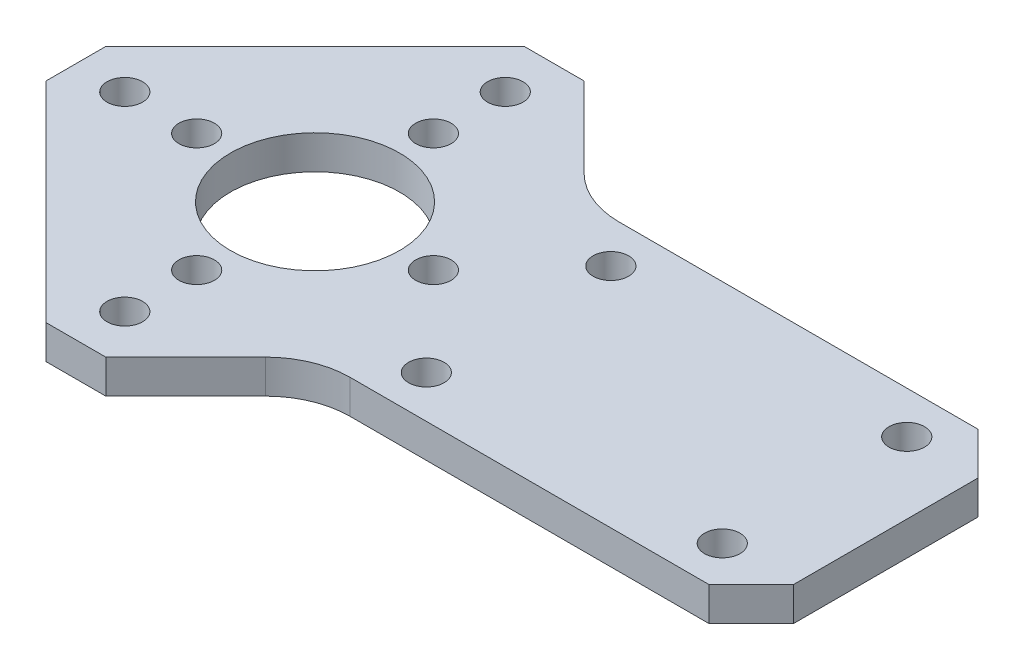
ISO-10303-21;
HEADER;
FILE_DESCRIPTION(('STEP AP214'),'2;1');
FILE_NAME('part.step','',(''),(''),'','','');
FILE_SCHEMA(('AUTOMOTIVE_DESIGN { 1 0 10303 214 1 1 1 1 }'));
ENDSEC;
DATA;
#1=APPLICATION_CONTEXT('core data for automotive mechanical design processes');
#2=APPLICATION_PROTOCOL_DEFINITION('international standard','automotive_design',2000,#1);
#3=PRODUCT_CONTEXT('',#1,'mechanical');
#4=PRODUCT('Part','Part','',(#3));
#5=PRODUCT_RELATED_PRODUCT_CATEGORY('part','',(#4));
#6=PRODUCT_DEFINITION_FORMATION('','',#4);
#7=PRODUCT_DEFINITION_CONTEXT('part definition',#1,'design');
#8=PRODUCT_DEFINITION('design','',#6,#7);
#9=PRODUCT_DEFINITION_SHAPE('','',#8);
#10=(LENGTH_UNIT() NAMED_UNIT(*) SI_UNIT(.MILLI.,.METRE.));
#11=(NAMED_UNIT(*) PLANE_ANGLE_UNIT() SI_UNIT($,.RADIAN.));
#12=(NAMED_UNIT(*) SI_UNIT($,.STERADIAN.) SOLID_ANGLE_UNIT());
#13=UNCERTAINTY_MEASURE_WITH_UNIT(LENGTH_MEASURE(1.E-05),#10,'distance_accuracy_value','');
#14=(GEOMETRIC_REPRESENTATION_CONTEXT(3) GLOBAL_UNCERTAINTY_ASSIGNED_CONTEXT((#13)) GLOBAL_UNIT_ASSIGNED_CONTEXT((#10,
#11,#12)) REPRESENTATION_CONTEXT('',''));
#15=CARTESIAN_POINT('',(0.,0.,0.));
#16=DIRECTION('',(0.,0.,1.));
#17=DIRECTION('',(1.,0.,0.));
#18=AXIS2_PLACEMENT_3D('',#15,#16,#17);
#19=CARTESIAN_POINT('',(15.9099025766973,4.,-15.9099025766975));
#20=DIRECTION('',(-0.707106781186543,0.,0.707106781186552));
#21=DIRECTION('',(0.707106781186552,0.,0.707106781186543));
#22=AXIS2_PLACEMENT_3D('',#19,#20,#21);
#23=PLANE('',#22);
#24=DIRECTION('',(0.,1.,0.));
#25=VECTOR('',#24,1.);
#26=CARTESIAN_POINT('',(3.53553390593254,4.,-28.284271247462));
#27=LINE('',#26,#25);
#28=CARTESIAN_POINT('',(3.53553390593254,0.,-28.284271247462));
#29=VERTEX_POINT('',#28);
#30=CARTESIAN_POINT('',(3.53553390593282,4.,-28.284271247462));
#31=VERTEX_POINT('',#30);
#32=EDGE_CURVE('E137',#29,#31,#27,.T.);
#33=ORIENTED_EDGE('',*,*,#32,.T.);
#34=DIRECTION('',(0.707106781186545,0.,0.70710678118655));
#35=VECTOR('',#34,1.);
#36=CARTESIAN_POINT('',(3.53553390593282,4.,-28.284271247462));
#37=LINE('',#36,#35);
#38=CARTESIAN_POINT('',(12.9809703885629,4.,-18.8388347648319));
#39=VERTEX_POINT('',#38);
#40=EDGE_CURVE('E140',#31,#39,#37,.T.);
#41=ORIENTED_EDGE('',*,*,#40,.T.);
#42=DIRECTION('',(0.,-1.,0.));
#43=VECTOR('',#42,1.);
#44=CARTESIAN_POINT('',(12.9809703885627,0.,-18.838834764832));
#45=LINE('',#44,#43);
#46=CARTESIAN_POINT('',(12.9809703885627,0.,-18.838834764832));
#47=VERTEX_POINT('',#46);
#48=EDGE_CURVE('E146',#39,#47,#45,.T.);
#49=ORIENTED_EDGE('',*,*,#48,.T.);
#50=DIRECTION('',(-0.707106781186552,0.,-0.707106781186543));
#51=VECTOR('',#50,1.);
#52=CARTESIAN_POINT('',(15.9099025766973,0.,-15.9099025766975));
#53=LINE('',#52,#51);
#54=EDGE_CURVE('E143',#47,#29,#53,.T.);
#55=ORIENTED_EDGE('',*,*,#54,.T.);
#56=EDGE_LOOP('',(#33,#41,#49,#55));
#57=FACE_BOUND('',#56,.T.);
#58=ADVANCED_FACE('F34',(#57),#23,.F.);
#59=CARTESIAN_POINT('',(15.9099025766973,4.,-15.9099025766975));
#60=DIRECTION('',(0.,0.,1.));
#61=DIRECTION('',(1.,0.,0.));
#62=AXIS2_PLACEMENT_3D('',#59,#60,#61);
#63=PLANE('',#62);
#64=DIRECTION('',(1.,0.,0.));
#65=VECTOR('',#64,1.);
#66=CARTESIAN_POINT('',(20.0520382004284,4.,-15.9099025766973));
#67=LINE('',#66,#65);
#68=CARTESIAN_POINT('',(20.0520382004284,4.,-15.9099025766973));
#69=VERTEX_POINT('',#68);
#70=CARTESIAN_POINT('',(62.5000000000002,4.,-15.9099025766975));
#71=VERTEX_POINT('',#70);
#72=EDGE_CURVE('E165',#69,#71,#67,.T.);
#73=ORIENTED_EDGE('',*,*,#72,.T.);
#74=DIRECTION('',(0.,-1.,0.));
#75=VECTOR('',#74,1.);
#76=CARTESIAN_POINT('',(62.5000000000002,4.,-15.9099025766975));
#77=LINE('',#76,#75);
#78=CARTESIAN_POINT('',(62.5000000000002,0.,-15.9099025766975));
#79=VERTEX_POINT('',#78);
#80=EDGE_CURVE('E11',#71,#79,#77,.T.);
#81=ORIENTED_EDGE('',*,*,#80,.T.);
#82=DIRECTION('',(-1.,0.,0.));
#83=VECTOR('',#82,1.);
#84=CARTESIAN_POINT('',(15.9099025766973,0.,-15.9099025766975));
#85=LINE('',#84,#83);
#86=CARTESIAN_POINT('',(20.0520382004282,0.,-15.9099025766975));
#87=VERTEX_POINT('',#86);
#88=EDGE_CURVE('E249',#79,#87,#85,.T.);
#89=ORIENTED_EDGE('',*,*,#88,.T.);
#90=DIRECTION('',(0.,-1.,0.));
#91=VECTOR('',#90,1.);
#92=CARTESIAN_POINT('',(20.0520382004282,4.,-15.9099025766975));
#93=LINE('',#92,#91);
#94=EDGE_CURVE('E289',#87,#69,#93,.F.);
#95=ORIENTED_EDGE('',*,*,#94,.T.);
#96=EDGE_LOOP('',(#73,#81,#89,#95));
#97=FACE_BOUND('',#96,.T.);
#98=ADVANCED_FACE('F364',(#97),#63,.F.);
#99=CARTESIAN_POINT('',(20.0520382004282,4.,-25.9099025766975));
#100=DIRECTION('',(0.,1.,0.));
#101=DIRECTION('',(0.,0.,1.));
#102=AXIS2_PLACEMENT_3D('',#99,#100,#101);
#103=CYLINDRICAL_SURFACE('',#102,10.);
#104=ORIENTED_EDGE('',*,*,#48,.F.);
#105=CARTESIAN_POINT('',(20.0520382004284,4.,-25.9099025766973));
#106=DIRECTION('',(0.,1.,0.));
#107=DIRECTION('',(0.,0.,-1.));
#108=AXIS2_PLACEMENT_3D('',#105,#106,#107);
#109=CIRCLE('',#108,10.);
#110=EDGE_CURVE('E162',#39,#69,#109,.T.);
#111=ORIENTED_EDGE('',*,*,#110,.T.);
#112=ORIENTED_EDGE('',*,*,#94,.F.);
#113=CARTESIAN_POINT('',(20.0520382004282,0.,-25.9099025766975));
#114=DIRECTION('',(0.,1.,0.));
#115=DIRECTION('',(0.,0.,1.));
#116=AXIS2_PLACEMENT_3D('',#113,#114,#115);
#117=CIRCLE('',#116,10.);
#118=EDGE_CURVE('E296',#47,#87,#117,.T.);
#119=ORIENTED_EDGE('',*,*,#118,.F.);
#120=EDGE_LOOP('',(#104,#111,#112,#119));
#121=FACE_BOUND('',#120,.T.);
#122=ADVANCED_FACE('F368',(#121),#103,.F.);
#123=CARTESIAN_POINT('',(0.,4.,0.));
#124=DIRECTION('',(0.,1.,0.));
#125=DIRECTION('',(0.,0.,1.));
#126=AXIS2_PLACEMENT_3D('',#123,#124,#125);
#127=PLANE('',#126);
#128=DIRECTION('',(1.,0.,0.));
#129=VECTOR('',#128,1.);
#130=CARTESIAN_POINT('',(15.9099025766975,4.,15.9099025766972));
#131=LINE('',#130,#129);
#132=CARTESIAN_POINT('',(20.0520382004285,4.,15.9099025766972));
#133=VERTEX_POINT('',#132);
#134=CARTESIAN_POINT('',(62.5000000000002,4.,15.9099025766972));
#135=VERTEX_POINT('',#134);
#136=EDGE_CURVE('E255',#133,#135,#131,.T.);
#137=ORIENTED_EDGE('',*,*,#136,.T.);
#138=DIRECTION('',(-0.707106781186549,0.,0.707106781186547));
#139=VECTOR('',#138,1.);
#140=CARTESIAN_POINT('',(39.2049512883486,4.,39.2049512883487));
#141=LINE('',#140,#139);
#142=CARTESIAN_POINT('',(67.5000000000002,4.,10.9099025766973));
#143=VERTEX_POINT('',#142);
#144=EDGE_CURVE('E42',#135,#143,#141,.F.);
#145=ORIENTED_EDGE('',*,*,#144,.T.);
#146=DIRECTION('',(0.,0.,1.));
#147=VECTOR('',#146,1.);
#148=CARTESIAN_POINT('',(67.5000000000002,4.,22.5000000000002));
#149=LINE('',#148,#147);
#150=CARTESIAN_POINT('',(67.5000000000002,4.,-10.9099025766975));
#151=VERTEX_POINT('',#150);
#152=EDGE_CURVE('E163',#151,#143,#149,.T.);
#153=ORIENTED_EDGE('',*,*,#152,.F.);
#154=DIRECTION('',(0.707106781186549,0.,0.707106781186547));
#155=VECTOR('',#154,1.);
#156=CARTESIAN_POINT('',(39.2049512883487,4.,-39.2049512883489));
#157=LINE('',#156,#155);
#158=EDGE_CURVE('E49',#151,#71,#157,.F.);
#159=ORIENTED_EDGE('',*,*,#158,.T.);
#160=ORIENTED_EDGE('',*,*,#72,.F.);
#161=ORIENTED_EDGE('',*,*,#110,.F.);
#162=ORIENTED_EDGE('',*,*,#40,.F.);
#163=DIRECTION('',(1.,0.,0.));
#164=VECTOR('',#163,1.);
#165=CARTESIAN_POINT('',(-1.38777878078145E-13,4.,-28.284271247462));
#166=LINE('',#165,#164);
#167=CARTESIAN_POINT('',(-3.53553390593293,4.,-28.284271247462));
#168=VERTEX_POINT('',#167);
#169=EDGE_CURVE('E150',#31,#168,#166,.F.);
#170=ORIENTED_EDGE('',*,*,#169,.T.);
#171=DIRECTION('',(-0.707106781186542,0.,0.707106781186553));
#172=VECTOR('',#171,1.);
#173=CARTESIAN_POINT('',(-2.28983498828939E-13,4.,-31.8198051533947));
#174=LINE('',#173,#172);
#175=CARTESIAN_POINT('',(-28.284271247462,4.,-3.53553390593253));
#176=VERTEX_POINT('',#175);
#177=EDGE_CURVE('E246',#168,#176,#174,.T.);
#178=ORIENTED_EDGE('',*,*,#177,.T.);
#179=DIRECTION('',(0.,0.,-1.));
#180=VECTOR('',#179,1.);
#181=CARTESIAN_POINT('',(-28.284271247462,4.,1.94289029309404E-13));
#182=LINE('',#181,#180);
#183=CARTESIAN_POINT('',(-28.284271247462,4.,3.53553390593293));
#184=VERTEX_POINT('',#183);
#185=EDGE_CURVE('E156',#176,#184,#182,.F.);
#186=ORIENTED_EDGE('',*,*,#185,.T.);
#187=DIRECTION('',(0.707106781186552,0.,0.707106781186543));
#188=VECTOR('',#187,1.);
#189=CARTESIAN_POINT('',(-31.8198051533947,4.,2.29990116303524E-13));
#190=LINE('',#189,#188);
#191=CARTESIAN_POINT('',(-3.53553390593255,4.,28.284271247462));
#192=VERTEX_POINT('',#191);
#193=EDGE_CURVE('E248',#184,#192,#190,.T.);
#194=ORIENTED_EDGE('',*,*,#193,.T.);
#195=DIRECTION('',(-1.,0.,0.));
#196=VECTOR('',#195,1.);
#197=CARTESIAN_POINT('',(1.5265566588596E-13,4.,28.284271247462));
#198=LINE('',#197,#196);
#199=CARTESIAN_POINT('',(3.53553390593293,4.,28.284271247462));
#200=VERTEX_POINT('',#199);
#201=EDGE_CURVE('E276',#192,#200,#198,.F.);
#202=ORIENTED_EDGE('',*,*,#201,.T.);
#203=DIRECTION('',(0.707106781186542,0.,-0.707106781186553));
#204=VECTOR('',#203,1.);
#205=CARTESIAN_POINT('',(2.20413579643825E-13,4.,31.8198051533947));
#206=LINE('',#205,#204);
#207=CARTESIAN_POINT('',(12.9809703885629,4.,18.8388347648318));
#208=VERTEX_POINT('',#207);
#209=EDGE_CURVE('E252',#200,#208,#206,.T.);
#210=ORIENTED_EDGE('',*,*,#209,.T.);
#211=CARTESIAN_POINT('',(20.0520382004285,4.,25.9099025766972));
#212=DIRECTION('',(0.,1.,0.));
#213=DIRECTION('',(0.,0.,1.));
#214=AXIS2_PLACEMENT_3D('',#211,#212,#213);
#215=CIRCLE('',#214,10.);
#216=EDGE_CURVE('E301',#208,#133,#215,.F.);
#217=ORIENTED_EDGE('',*,*,#216,.T.);
#218=EDGE_LOOP('',(#137,#145,#153,#159,#160,#161,#162,#170,#178,#186,#194,#202,#210,#217));
#219=FACE_BOUND('',#218,.T.);
#220=CARTESIAN_POINT('',(24.0756849520543,4.,-10.9099025766973));
#221=DIRECTION('',(0.,1.,0.));
#222=DIRECTION('',(0.,0.,1.));
#223=AXIS2_PLACEMENT_3D('',#220,#221,#222);
#224=CIRCLE('',#223,2.1);
#225=CARTESIAN_POINT('',(24.0756849520543,4.,-8.80990257669733));
#226=VERTEX_POINT('',#225);
#227=EDGE_CURVE('E177',#226,#226,#224,.T.);
#228=ORIENTED_EDGE('',*,*,#227,.F.);
#229=EDGE_LOOP('',(#228));
#230=FACE_BOUND('',#229,.T.);
#231=CARTESIAN_POINT('',(59.0756849520543,4.,-10.9099025766974));
#232=DIRECTION('',(0.,1.,0.));
#233=DIRECTION('',(0.,0.,1.));
#234=AXIS2_PLACEMENT_3D('',#231,#232,#233);
#235=CIRCLE('',#234,2.1);
#236=CARTESIAN_POINT('',(59.0756849520543,4.,-8.80990257669744));
#237=VERTEX_POINT('',#236);
#238=EDGE_CURVE('E183',#237,#237,#235,.T.);
#239=ORIENTED_EDGE('',*,*,#238,.F.);
#240=EDGE_LOOP('',(#239));
#241=FACE_BOUND('',#240,.T.);
#242=CARTESIAN_POINT('',(59.0756849520544,4.,10.9099025766972));
#243=DIRECTION('',(0.,1.,0.));
#244=DIRECTION('',(0.,0.,1.));
#245=AXIS2_PLACEMENT_3D('',#242,#243,#244);
#246=CIRCLE('',#245,2.1);
#247=CARTESIAN_POINT('',(59.0756849520544,4.,13.0099025766972));
#248=VERTEX_POINT('',#247);
#249=EDGE_CURVE('E189',#248,#248,#246,.T.);
#250=ORIENTED_EDGE('',*,*,#249,.F.);
#251=EDGE_LOOP('',(#250));
#252=FACE_BOUND('',#251,.T.);
#253=CARTESIAN_POINT('',(24.0756849520544,4.,10.9099025766972));
#254=DIRECTION('',(0.,1.,0.));
#255=DIRECTION('',(0.,0.,1.));
#256=AXIS2_PLACEMENT_3D('',#253,#254,#255);
#257=CIRCLE('',#256,2.1);
#258=CARTESIAN_POINT('',(24.0756849520544,4.,13.0099025766972));
#259=VERTEX_POINT('',#258);
#260=EDGE_CURVE('E195',#259,#259,#257,.T.);
#261=ORIENTED_EDGE('',*,*,#260,.F.);
#262=EDGE_LOOP('',(#261));
#263=FACE_BOUND('',#262,.T.);
#264=CARTESIAN_POINT('',(0.,4.,0.));
#265=DIRECTION('',(0.,1.,0.));
#266=DIRECTION('',(0.,0.,1.));
#267=AXIS2_PLACEMENT_3D('',#264,#265,#266);
#268=CIRCLE('',#267,10.);
#269=CARTESIAN_POINT('',(0.,4.,10.));
#270=VERTEX_POINT('',#269);
#271=EDGE_CURVE('E205',#270,#270,#268,.T.);
#272=ORIENTED_EDGE('',*,*,#271,.F.);
#273=EDGE_LOOP('',(#272));
#274=FACE_BOUND('',#273,.T.);
#275=CARTESIAN_POINT('',(-14.0000000000017,4.,0.));
#276=DIRECTION('',(0.,1.,0.));
#277=DIRECTION('',(0.,0.,1.));
#278=AXIS2_PLACEMENT_3D('',#275,#276,#277);
#279=CIRCLE('',#278,2.1);
#280=CARTESIAN_POINT('',(-14.0000000000017,4.,2.1));
#281=VERTEX_POINT('',#280);
#282=EDGE_CURVE('E223',#281,#281,#279,.T.);
#283=ORIENTED_EDGE('',*,*,#282,.F.);
#284=EDGE_LOOP('',(#283));
#285=FACE_BOUND('',#284,.T.);
#286=CARTESIAN_POINT('',(14.0000000000017,4.,0.));
#287=DIRECTION('',(0.,1.,0.));
#288=DIRECTION('',(0.,0.,1.));
#289=AXIS2_PLACEMENT_3D('',#286,#287,#288);
#290=CIRCLE('',#289,2.1);
#291=CARTESIAN_POINT('',(14.0000000000017,4.,2.1));
#292=VERTEX_POINT('',#291);
#293=EDGE_CURVE('E235',#292,#292,#290,.T.);
#294=ORIENTED_EDGE('',*,*,#293,.F.);
#295=EDGE_LOOP('',(#294));
#296=FACE_BOUND('',#295,.T.);
#297=CARTESIAN_POINT('',(0.,4.,-14.0000000000017));
#298=DIRECTION('',(0.,1.,0.));
#299=DIRECTION('',(0.,0.,1.));
#300=AXIS2_PLACEMENT_3D('',#297,#298,#299);
#301=CIRCLE('',#300,2.1);
#302=CARTESIAN_POINT('',(0.,4.,-11.9000000000017));
#303=VERTEX_POINT('',#302);
#304=EDGE_CURVE('E241',#303,#303,#301,.T.);
#305=ORIENTED_EDGE('',*,*,#304,.F.);
#306=EDGE_LOOP('',(#305));
#307=FACE_BOUND('',#306,.T.);
#308=CARTESIAN_POINT('',(0.,4.,14.0000000000017));
#309=DIRECTION('',(0.,1.,0.));
#310=DIRECTION('',(0.,0.,1.));
#311=AXIS2_PLACEMENT_3D('',#308,#309,#310);
#312=CIRCLE('',#311,2.1);
#313=CARTESIAN_POINT('',(0.,4.,16.1000000000017));
#314=VERTEX_POINT('',#313);
#315=EDGE_CURVE('E229',#314,#314,#312,.T.);
#316=ORIENTED_EDGE('',*,*,#315,.F.);
#317=EDGE_LOOP('',(#316));
#318=FACE_BOUND('',#317,.T.);
#319=CARTESIAN_POINT('',(0.,4.,-22.5000000000001));
#320=DIRECTION('',(0.,1.,0.));
#321=DIRECTION('',(0.,0.,1.));
#322=AXIS2_PLACEMENT_3D('',#319,#320,#321);
#323=CIRCLE('',#322,2.09999999999998);
#324=CARTESIAN_POINT('',(0.,4.,-20.4000000000001));
#325=VERTEX_POINT('',#324);
#326=EDGE_CURVE('E217',#325,#325,#323,.T.);
#327=ORIENTED_EDGE('',*,*,#326,.F.);
#328=EDGE_LOOP('',(#327));
#329=FACE_BOUND('',#328,.T.);
#330=CARTESIAN_POINT('',(0.,4.,22.5000000000001));
#331=DIRECTION('',(0.,1.,0.));
#332=DIRECTION('',(0.,0.,1.));
#333=AXIS2_PLACEMENT_3D('',#330,#331,#332);
#334=CIRCLE('',#333,2.1);
#335=CARTESIAN_POINT('',(0.,4.,24.6000000000001));
#336=VERTEX_POINT('',#335);
#337=EDGE_CURVE('E211',#336,#336,#334,.T.);
#338=ORIENTED_EDGE('',*,*,#337,.F.);
#339=EDGE_LOOP('',(#338));
#340=FACE_BOUND('',#339,.T.);
#341=CARTESIAN_POINT('',(-22.5000000000001,4.,0.));
#342=DIRECTION('',(0.,1.,0.));
#343=DIRECTION('',(0.,0.,1.));
#344=AXIS2_PLACEMENT_3D('',#341,#342,#343);
#345=CIRCLE('',#344,2.10000000000007);
#346=CARTESIAN_POINT('',(-22.5000000000001,4.,2.10000000000007));
#347=VERTEX_POINT('',#346);
#348=EDGE_CURVE('E199',#347,#347,#345,.T.);
#349=ORIENTED_EDGE('',*,*,#348,.F.);
#350=EDGE_LOOP('',(#349));
#351=FACE_BOUND('',#350,.T.);
#352=ADVANCED_FACE('F159',(#219,#230,#241,#252,#263,#274,#285,#296,#307,#318,#329,#340,#351),
#127,.T.);
#353=CARTESIAN_POINT('',(0.,0.,0.));
#354=DIRECTION('',(0.,1.,0.));
#355=DIRECTION('',(0.,0.,1.));
#356=AXIS2_PLACEMENT_3D('',#353,#354,#355);
#357=PLANE('',#356);
#358=CARTESIAN_POINT('',(24.0756849520543,0.,-10.9099025766973));
#359=DIRECTION('',(0.,-1.,0.));
#360=DIRECTION('',(0.,0.,1.));
#361=AXIS2_PLACEMENT_3D('',#358,#359,#360);
#362=CIRCLE('',#361,2.1);
#363=CARTESIAN_POINT('',(24.0756849520543,0.,-8.80990257669733));
#364=VERTEX_POINT('',#363);
#365=EDGE_CURVE('E174',#364,#364,#362,.T.);
#366=ORIENTED_EDGE('',*,*,#365,.F.);
#367=EDGE_LOOP('',(#366));
#368=FACE_BOUND('',#367,.T.);
#369=CARTESIAN_POINT('',(59.0756849520543,0.,-10.9099025766974));
#370=DIRECTION('',(0.,-1.,0.));
#371=DIRECTION('',(0.,0.,1.));
#372=AXIS2_PLACEMENT_3D('',#369,#370,#371);
#373=CIRCLE('',#372,2.1);
#374=CARTESIAN_POINT('',(59.0756849520543,0.,-8.80990257669744));
#375=VERTEX_POINT('',#374);
#376=EDGE_CURVE('E180',#375,#375,#373,.T.);
#377=ORIENTED_EDGE('',*,*,#376,.F.);
#378=EDGE_LOOP('',(#377));
#379=FACE_BOUND('',#378,.T.);
#380=CARTESIAN_POINT('',(59.0756849520544,0.,10.9099025766972));
#381=DIRECTION('',(0.,-1.,0.));
#382=DIRECTION('',(0.,0.,-1.));
#383=AXIS2_PLACEMENT_3D('',#380,#381,#382);
#384=CIRCLE('',#383,2.1);
#385=CARTESIAN_POINT('',(59.0756849520544,0.,8.80990257669725));
#386=VERTEX_POINT('',#385);
#387=EDGE_CURVE('E186',#386,#386,#384,.T.);
#388=ORIENTED_EDGE('',*,*,#387,.F.);
#389=EDGE_LOOP('',(#388));
#390=FACE_BOUND('',#389,.T.);
#391=CARTESIAN_POINT('',(24.0756849520544,0.,10.9099025766972));
#392=DIRECTION('',(0.,-1.,0.));
#393=DIRECTION('',(0.,0.,-1.));
#394=AXIS2_PLACEMENT_3D('',#391,#392,#393);
#395=CIRCLE('',#394,2.1);
#396=CARTESIAN_POINT('',(24.0756849520544,0.,8.80990257669725));
#397=VERTEX_POINT('',#396);
#398=EDGE_CURVE('E192',#397,#397,#395,.T.);
#399=ORIENTED_EDGE('',*,*,#398,.F.);
#400=EDGE_LOOP('',(#399));
#401=FACE_BOUND('',#400,.T.);
#402=DIRECTION('',(0.,0.,1.));
#403=VECTOR('',#402,1.);
#404=CARTESIAN_POINT('',(67.5000000000002,0.,0.));
#405=LINE('',#404,#403);
#406=CARTESIAN_POINT('',(67.5000000000002,0.,-10.9099025766975));
#407=VERTEX_POINT('',#406);
#408=CARTESIAN_POINT('',(67.5000000000002,0.,10.9099025766972));
#409=VERTEX_POINT('',#408);
#410=EDGE_CURVE('E171',#407,#409,#405,.T.);
#411=ORIENTED_EDGE('',*,*,#410,.T.);
#412=DIRECTION('',(0.707106781186549,0.,-0.707106781186547));
#413=VECTOR('',#412,1.);
#414=CARTESIAN_POINT('',(67.5000000000002,0.,10.9099025766972));
#415=LINE('',#414,#413);
#416=CARTESIAN_POINT('',(62.5000000000002,0.,15.9099025766972));
#417=VERTEX_POINT('',#416);
#418=EDGE_CURVE('E311',#409,#417,#415,.F.);
#419=ORIENTED_EDGE('',*,*,#418,.T.);
#420=DIRECTION('',(1.,0.,0.));
#421=VECTOR('',#420,1.);
#422=CARTESIAN_POINT('',(15.9099025766975,0.,15.9099025766972));
#423=LINE('',#422,#421);
#424=CARTESIAN_POINT('',(20.0520382004285,0.,15.9099025766972));
#425=VERTEX_POINT('',#424);
#426=EDGE_CURVE('E268',#425,#417,#423,.T.);
#427=ORIENTED_EDGE('',*,*,#426,.F.);
#428=CARTESIAN_POINT('',(20.0520382004285,0.,25.9099025766972));
#429=DIRECTION('',(0.,1.,0.));
#430=DIRECTION('',(0.,0.,1.));
#431=AXIS2_PLACEMENT_3D('',#428,#429,#430);
#432=CIRCLE('',#431,10.);
#433=CARTESIAN_POINT('',(12.9809703885629,0.,18.8388347648318));
#434=VERTEX_POINT('',#433);
#435=EDGE_CURVE('E299',#425,#434,#432,.T.);
#436=ORIENTED_EDGE('',*,*,#435,.T.);
#437=DIRECTION('',(0.707106781186542,0.,-0.707106781186553));
#438=VECTOR('',#437,1.);
#439=CARTESIAN_POINT('',(2.20413579643825E-13,0.,31.8198051533947));
#440=LINE('',#439,#438);
#441=CARTESIAN_POINT('',(3.53553390593293,0.,28.284271247462));
#442=VERTEX_POINT('',#441);
#443=EDGE_CURVE('E265',#442,#434,#440,.T.);
#444=ORIENTED_EDGE('',*,*,#443,.F.);
#445=DIRECTION('',(1.,0.,0.));
#446=VECTOR('',#445,1.);
#447=CARTESIAN_POINT('',(3.53553390593293,0.,28.284271247462));
#448=LINE('',#447,#446);
#449=CARTESIAN_POINT('',(-3.53553390593255,0.,28.284271247462));
#450=VERTEX_POINT('',#449);
#451=EDGE_CURVE('E157',#442,#450,#448,.F.);
#452=ORIENTED_EDGE('',*,*,#451,.T.);
#453=DIRECTION('',(0.707106781186552,0.,0.707106781186543));
#454=VECTOR('',#453,1.);
#455=CARTESIAN_POINT('',(-31.8198051533947,0.,2.29990116303524E-13));
#456=LINE('',#455,#454);
#457=CARTESIAN_POINT('',(-28.284271247462,0.,3.53553390593293));
#458=VERTEX_POINT('',#457);
#459=EDGE_CURVE('E262',#458,#450,#456,.T.);
#460=ORIENTED_EDGE('',*,*,#459,.F.);
#461=DIRECTION('',(0.,0.,1.));
#462=VECTOR('',#461,1.);
#463=CARTESIAN_POINT('',(-28.284271247462,0.,3.53553390593293));
#464=LINE('',#463,#462);
#465=CARTESIAN_POINT('',(-28.284271247462,0.,-3.53553390593252));
#466=VERTEX_POINT('',#465);
#467=EDGE_CURVE('E272',#458,#466,#464,.F.);
#468=ORIENTED_EDGE('',*,*,#467,.T.);
#469=DIRECTION('',(-0.707106781186542,0.,0.707106781186553));
#470=VECTOR('',#469,1.);
#471=CARTESIAN_POINT('',(-2.28983498828939E-13,0.,-31.8198051533947));
#472=LINE('',#471,#470);
#473=CARTESIAN_POINT('',(-3.53553390593293,0.,-28.284271247462));
#474=VERTEX_POINT('',#473);
#475=EDGE_CURVE('E259',#474,#466,#472,.T.);
#476=ORIENTED_EDGE('',*,*,#475,.F.);
#477=DIRECTION('',(-1.,0.,0.));
#478=VECTOR('',#477,1.);
#479=CARTESIAN_POINT('',(-3.53553390593293,0.,-28.284271247462));
#480=LINE('',#479,#478);
#481=EDGE_CURVE('E257',#474,#29,#480,.F.);
#482=ORIENTED_EDGE('',*,*,#481,.T.);
#483=ORIENTED_EDGE('',*,*,#54,.F.);
#484=ORIENTED_EDGE('',*,*,#118,.T.);
#485=ORIENTED_EDGE('',*,*,#88,.F.);
#486=DIRECTION('',(-0.707106781186549,0.,-0.707106781186547));
#487=VECTOR('',#486,1.);
#488=CARTESIAN_POINT('',(67.5000000000002,0.,-10.9099025766975));
#489=LINE('',#488,#487);
#490=EDGE_CURVE('E309',#79,#407,#489,.F.);
#491=ORIENTED_EDGE('',*,*,#490,.T.);
#492=EDGE_LOOP('',(#411,#419,#427,#436,#444,#452,#460,#468,#476,#482,#483,#484,#485,#491));
#493=FACE_BOUND('',#492,.T.);
#494=CARTESIAN_POINT('',(0.,0.,-14.0000000000017));
#495=DIRECTION('',(0.,1.,0.));
#496=DIRECTION('',(0.,0.,1.));
#497=AXIS2_PLACEMENT_3D('',#494,#495,#496);
#498=CIRCLE('',#497,2.1);
#499=CARTESIAN_POINT('',(0.,0.,-11.9000000000017));
#500=VERTEX_POINT('',#499);
#501=EDGE_CURVE('E238',#500,#500,#498,.T.);
#502=ORIENTED_EDGE('',*,*,#501,.T.);
#503=EDGE_LOOP('',(#502));
#504=FACE_BOUND('',#503,.T.);
#505=CARTESIAN_POINT('',(14.0000000000017,0.,0.));
#506=DIRECTION('',(0.,1.,0.));
#507=DIRECTION('',(0.,0.,1.));
#508=AXIS2_PLACEMENT_3D('',#505,#506,#507);
#509=CIRCLE('',#508,2.1);
#510=CARTESIAN_POINT('',(14.0000000000017,0.,2.1));
#511=VERTEX_POINT('',#510);
#512=EDGE_CURVE('E232',#511,#511,#509,.T.);
#513=ORIENTED_EDGE('',*,*,#512,.T.);
#514=EDGE_LOOP('',(#513));
#515=FACE_BOUND('',#514,.T.);
#516=CARTESIAN_POINT('',(0.,0.,14.0000000000017));
#517=DIRECTION('',(0.,1.,0.));
#518=DIRECTION('',(0.,0.,1.));
#519=AXIS2_PLACEMENT_3D('',#516,#517,#518);
#520=CIRCLE('',#519,2.1);
#521=CARTESIAN_POINT('',(0.,0.,16.1000000000017));
#522=VERTEX_POINT('',#521);
#523=EDGE_CURVE('E226',#522,#522,#520,.T.);
#524=ORIENTED_EDGE('',*,*,#523,.T.);
#525=EDGE_LOOP('',(#524));
#526=FACE_BOUND('',#525,.T.);
#527=CARTESIAN_POINT('',(-14.0000000000017,0.,0.));
#528=DIRECTION('',(0.,1.,0.));
#529=DIRECTION('',(0.,0.,1.));
#530=AXIS2_PLACEMENT_3D('',#527,#528,#529);
#531=CIRCLE('',#530,2.1);
#532=CARTESIAN_POINT('',(-14.0000000000017,0.,2.1));
#533=VERTEX_POINT('',#532);
#534=EDGE_CURVE('E220',#533,#533,#531,.T.);
#535=ORIENTED_EDGE('',*,*,#534,.T.);
#536=EDGE_LOOP('',(#535));
#537=FACE_BOUND('',#536,.T.);
#538=CARTESIAN_POINT('',(0.,0.,-22.5000000000001));
#539=DIRECTION('',(0.,1.,0.));
#540=DIRECTION('',(0.,0.,1.));
#541=AXIS2_PLACEMENT_3D('',#538,#539,#540);
#542=CIRCLE('',#541,2.09999999999998);
#543=CARTESIAN_POINT('',(0.,0.,-20.4000000000001));
#544=VERTEX_POINT('',#543);
#545=EDGE_CURVE('E214',#544,#544,#542,.T.);
#546=ORIENTED_EDGE('',*,*,#545,.T.);
#547=EDGE_LOOP('',(#546));
#548=FACE_BOUND('',#547,.T.);
#549=CARTESIAN_POINT('',(0.,0.,22.5000000000001));
#550=DIRECTION('',(0.,1.,0.));
#551=DIRECTION('',(0.,0.,1.));
#552=AXIS2_PLACEMENT_3D('',#549,#550,#551);
#553=CIRCLE('',#552,2.1);
#554=CARTESIAN_POINT('',(0.,0.,24.6000000000001));
#555=VERTEX_POINT('',#554);
#556=EDGE_CURVE('E208',#555,#555,#553,.T.);
#557=ORIENTED_EDGE('',*,*,#556,.T.);
#558=EDGE_LOOP('',(#557));
#559=FACE_BOUND('',#558,.T.);
#560=CARTESIAN_POINT('',(0.,0.,0.));
#561=DIRECTION('',(0.,1.,0.));
#562=DIRECTION('',(0.,0.,1.));
#563=AXIS2_PLACEMENT_3D('',#560,#561,#562);
#564=CIRCLE('',#563,10.);
#565=CARTESIAN_POINT('',(0.,0.,10.));
#566=VERTEX_POINT('',#565);
#567=EDGE_CURVE('E202',#566,#566,#564,.T.);
#568=ORIENTED_EDGE('',*,*,#567,.T.);
#569=EDGE_LOOP('',(#568));
#570=FACE_BOUND('',#569,.T.);
#571=CARTESIAN_POINT('',(-22.5000000000001,0.,0.));
#572=DIRECTION('',(0.,1.,0.));
#573=DIRECTION('',(0.,0.,1.));
#574=AXIS2_PLACEMENT_3D('',#571,#572,#573);
#575=CIRCLE('',#574,2.10000000000007);
#576=CARTESIAN_POINT('',(-22.5000000000001,0.,2.10000000000007));
#577=VERTEX_POINT('',#576);
#578=EDGE_CURVE('E198',#577,#577,#575,.T.);
#579=ORIENTED_EDGE('',*,*,#578,.T.);
#580=EDGE_LOOP('',(#579));
#581=FACE_BOUND('',#580,.T.);
#582=ADVANCED_FACE('F324',(#368,#379,#390,#401,#493,#504,#515,#526,#537,#548,#559,#570,#581),
#357,.F.);
#583=CARTESIAN_POINT('',(-2.28983498828939E-13,4.,-31.8198051533947));
#584=DIRECTION('',(0.707106781186553,0.,0.707106781186542));
#585=DIRECTION('',(0.707106781186542,0.,-0.707106781186553));
#586=AXIS2_PLACEMENT_3D('',#583,#584,#585);
#587=PLANE('',#586);
#588=ORIENTED_EDGE('',*,*,#475,.T.);
#589=DIRECTION('',(0.,1.,0.));
#590=VECTOR('',#589,1.);
#591=CARTESIAN_POINT('',(-28.284271247462,4.,-3.53553390593252));
#592=LINE('',#591,#590);
#593=EDGE_CURVE('E147',#466,#176,#592,.T.);
#594=ORIENTED_EDGE('',*,*,#593,.T.);
#595=ORIENTED_EDGE('',*,*,#177,.F.);
#596=DIRECTION('',(0.,-1.,0.));
#597=VECTOR('',#596,1.);
#598=CARTESIAN_POINT('',(-3.53553390593293,4.,-28.284271247462));
#599=LINE('',#598,#597);
#600=EDGE_CURVE('E153',#168,#474,#599,.T.);
#601=ORIENTED_EDGE('',*,*,#600,.T.);
#602=EDGE_LOOP('',(#588,#594,#595,#601));
#603=FACE_BOUND('',#602,.T.);
#604=ADVANCED_FACE('F352',(#603),#587,.F.);
#605=CARTESIAN_POINT('',(-31.8198051533947,4.,2.29990116303524E-13));
#606=DIRECTION('',(0.707106781186543,0.,-0.707106781186552));
#607=DIRECTION('',(-0.707106781186552,0.,-0.707106781186543));
#608=AXIS2_PLACEMENT_3D('',#605,#606,#607);
#609=PLANE('',#608);
#610=ORIENTED_EDGE('',*,*,#459,.T.);
#611=DIRECTION('',(0.,1.,0.));
#612=VECTOR('',#611,1.);
#613=CARTESIAN_POINT('',(-3.53553390593256,4.,28.284271247462));
#614=LINE('',#613,#612);
#615=EDGE_CURVE('E284',#450,#192,#614,.T.);
#616=ORIENTED_EDGE('',*,*,#615,.T.);
#617=ORIENTED_EDGE('',*,*,#193,.F.);
#618=DIRECTION('',(0.,-1.,0.));
#619=VECTOR('',#618,1.);
#620=CARTESIAN_POINT('',(-28.284271247462,4.,3.53553390593293));
#621=LINE('',#620,#619);
#622=EDGE_CURVE('E281',#184,#458,#621,.T.);
#623=ORIENTED_EDGE('',*,*,#622,.T.);
#624=EDGE_LOOP('',(#610,#616,#617,#623));
#625=FACE_BOUND('',#624,.T.);
#626=ADVANCED_FACE('F343',(#625),#609,.F.);
#627=CARTESIAN_POINT('',(2.20413579643825E-13,4.,31.8198051533947));
#628=DIRECTION('',(-0.707106781186553,0.,-0.707106781186542));
#629=DIRECTION('',(-0.707106781186542,0.,0.707106781186553));
#630=AXIS2_PLACEMENT_3D('',#627,#628,#629);
#631=PLANE('',#630);
#632=ORIENTED_EDGE('',*,*,#443,.T.);
#633=DIRECTION('',(0.,-1.,0.));
#634=VECTOR('',#633,1.);
#635=CARTESIAN_POINT('',(12.9809703885629,4.,18.8388347648318));
#636=LINE('',#635,#634);
#637=EDGE_CURVE('E294',#434,#208,#636,.F.);
#638=ORIENTED_EDGE('',*,*,#637,.T.);
#639=ORIENTED_EDGE('',*,*,#209,.F.);
#640=DIRECTION('',(0.,-1.,0.));
#641=VECTOR('',#640,1.);
#642=CARTESIAN_POINT('',(3.53553390593293,4.,28.284271247462));
#643=LINE('',#642,#641);
#644=EDGE_CURVE('E278',#200,#442,#643,.T.);
#645=ORIENTED_EDGE('',*,*,#644,.T.);
#646=EDGE_LOOP('',(#632,#638,#639,#645));
#647=FACE_BOUND('',#646,.T.);
#648=ADVANCED_FACE('F334',(#647),#631,.F.);
#649=CARTESIAN_POINT('',(15.9099025766975,4.,15.9099025766972));
#650=DIRECTION('',(0.,0.,-1.));
#651=DIRECTION('',(-1.,0.,0.));
#652=AXIS2_PLACEMENT_3D('',#649,#650,#651);
#653=PLANE('',#652);
#654=ORIENTED_EDGE('',*,*,#426,.T.);
#655=DIRECTION('',(0.,1.,0.));
#656=VECTOR('',#655,1.);
#657=CARTESIAN_POINT('',(62.5000000000002,4.,15.9099025766972));
#658=LINE('',#657,#656);
#659=EDGE_CURVE('E57',#417,#135,#658,.T.);
#660=ORIENTED_EDGE('',*,*,#659,.T.);
#661=ORIENTED_EDGE('',*,*,#136,.F.);
#662=DIRECTION('',(0.,-1.,0.));
#663=VECTOR('',#662,1.);
#664=CARTESIAN_POINT('',(20.0520382004285,0.,15.9099025766972));
#665=LINE('',#664,#663);
#666=EDGE_CURVE('E291',#133,#425,#665,.T.);
#667=ORIENTED_EDGE('',*,*,#666,.T.);
#668=EDGE_LOOP('',(#654,#660,#661,#667));
#669=FACE_BOUND('',#668,.T.);
#670=ADVANCED_FACE('F326',(#669),#653,.F.);
#671=CARTESIAN_POINT('',(0.,4.,-14.0000000000017));
#672=DIRECTION('',(0.,-1.,0.));
#673=DIRECTION('',(0.,0.,-1.));
#674=AXIS2_PLACEMENT_3D('',#671,#672,#673);
#675=CYLINDRICAL_SURFACE('',#674,2.1);
#676=ORIENTED_EDGE('',*,*,#304,.T.);
#677=EDGE_LOOP('',(#676));
#678=FACE_BOUND('',#677,.T.);
#679=ORIENTED_EDGE('',*,*,#501,.F.);
#680=EDGE_LOOP('',(#679));
#681=FACE_BOUND('',#680,.T.);
#682=ADVANCED_FACE('F435',(#678,#681),#675,.F.);
#683=CARTESIAN_POINT('',(14.0000000000017,4.,0.));
#684=DIRECTION('',(0.,-1.,0.));
#685=DIRECTION('',(0.,0.,-1.));
#686=AXIS2_PLACEMENT_3D('',#683,#684,#685);
#687=CYLINDRICAL_SURFACE('',#686,2.1);
#688=ORIENTED_EDGE('',*,*,#293,.T.);
#689=EDGE_LOOP('',(#688));
#690=FACE_BOUND('',#689,.T.);
#691=ORIENTED_EDGE('',*,*,#512,.F.);
#692=EDGE_LOOP('',(#691));
#693=FACE_BOUND('',#692,.T.);
#694=ADVANCED_FACE('F431',(#690,#693),#687,.F.);
#695=CARTESIAN_POINT('',(0.,4.,14.0000000000017));
#696=DIRECTION('',(0.,-1.,0.));
#697=DIRECTION('',(0.,0.,-1.));
#698=AXIS2_PLACEMENT_3D('',#695,#696,#697);
#699=CYLINDRICAL_SURFACE('',#698,2.1);
#700=ORIENTED_EDGE('',*,*,#315,.T.);
#701=EDGE_LOOP('',(#700));
#702=FACE_BOUND('',#701,.T.);
#703=ORIENTED_EDGE('',*,*,#523,.F.);
#704=EDGE_LOOP('',(#703));
#705=FACE_BOUND('',#704,.T.);
#706=ADVANCED_FACE('F427',(#702,#705),#699,.F.);
#707=CARTESIAN_POINT('',(-14.0000000000017,4.,0.));
#708=DIRECTION('',(0.,-1.,0.));
#709=DIRECTION('',(0.,0.,-1.));
#710=AXIS2_PLACEMENT_3D('',#707,#708,#709);
#711=CYLINDRICAL_SURFACE('',#710,2.1);
#712=ORIENTED_EDGE('',*,*,#282,.T.);
#713=EDGE_LOOP('',(#712));
#714=FACE_BOUND('',#713,.T.);
#715=ORIENTED_EDGE('',*,*,#534,.F.);
#716=EDGE_LOOP('',(#715));
#717=FACE_BOUND('',#716,.T.);
#718=ADVANCED_FACE('F423',(#714,#717),#711,.F.);
#719=CARTESIAN_POINT('',(0.,4.,-22.5000000000001));
#720=DIRECTION('',(0.,-1.,0.));
#721=DIRECTION('',(0.,0.,-1.));
#722=AXIS2_PLACEMENT_3D('',#719,#720,#721);
#723=CYLINDRICAL_SURFACE('',#722,2.09999999999998);
#724=ORIENTED_EDGE('',*,*,#326,.T.);
#725=EDGE_LOOP('',(#724));
#726=FACE_BOUND('',#725,.T.);
#727=ORIENTED_EDGE('',*,*,#545,.F.);
#728=EDGE_LOOP('',(#727));
#729=FACE_BOUND('',#728,.T.);
#730=ADVANCED_FACE('F419',(#726,#729),#723,.F.);
#731=CARTESIAN_POINT('',(0.,4.,22.5000000000001));
#732=DIRECTION('',(0.,-1.,0.));
#733=DIRECTION('',(0.,0.,-1.));
#734=AXIS2_PLACEMENT_3D('',#731,#732,#733);
#735=CYLINDRICAL_SURFACE('',#734,2.1);
#736=ORIENTED_EDGE('',*,*,#337,.T.);
#737=EDGE_LOOP('',(#736));
#738=FACE_BOUND('',#737,.T.);
#739=ORIENTED_EDGE('',*,*,#556,.F.);
#740=EDGE_LOOP('',(#739));
#741=FACE_BOUND('',#740,.T.);
#742=ADVANCED_FACE('F415',(#738,#741),#735,.F.);
#743=CARTESIAN_POINT('',(0.,4.,0.));
#744=DIRECTION('',(0.,-1.,0.));
#745=DIRECTION('',(0.,0.,-1.));
#746=AXIS2_PLACEMENT_3D('',#743,#744,#745);
#747=CYLINDRICAL_SURFACE('',#746,10.);
#748=ORIENTED_EDGE('',*,*,#271,.T.);
#749=EDGE_LOOP('',(#748));
#750=FACE_BOUND('',#749,.T.);
#751=ORIENTED_EDGE('',*,*,#567,.F.);
#752=EDGE_LOOP('',(#751));
#753=FACE_BOUND('',#752,.T.);
#754=ADVANCED_FACE('F411',(#750,#753),#747,.F.);
#755=CARTESIAN_POINT('',(-22.5000000000001,4.,0.));
#756=DIRECTION('',(0.,-1.,0.));
#757=DIRECTION('',(0.,0.,-1.));
#758=AXIS2_PLACEMENT_3D('',#755,#756,#757);
#759=CYLINDRICAL_SURFACE('',#758,2.10000000000007);
#760=ORIENTED_EDGE('',*,*,#348,.T.);
#761=EDGE_LOOP('',(#760));
#762=FACE_BOUND('',#761,.T.);
#763=ORIENTED_EDGE('',*,*,#578,.F.);
#764=EDGE_LOOP('',(#763));
#765=FACE_BOUND('',#764,.T.);
#766=ADVANCED_FACE('F374',(#762,#765),#759,.F.);
#767=CARTESIAN_POINT('',(3.53553390593293,4.,28.284271247462));
#768=DIRECTION('',(0.,0.,-1.));
#769=DIRECTION('',(0.,-1.,0.));
#770=AXIS2_PLACEMENT_3D('',#767,#768,#769);
#771=PLANE('',#770);
#772=ORIENTED_EDGE('',*,*,#201,.F.);
#773=ORIENTED_EDGE('',*,*,#615,.F.);
#774=ORIENTED_EDGE('',*,*,#451,.F.);
#775=ORIENTED_EDGE('',*,*,#644,.F.);
#776=EDGE_LOOP('',(#772,#773,#774,#775));
#777=FACE_BOUND('',#776,.T.);
#778=ADVANCED_FACE('F339',(#777),#771,.F.);
#779=CARTESIAN_POINT('',(-28.284271247462,4.,3.53553390593293));
#780=DIRECTION('',(1.,0.,0.));
#781=DIRECTION('',(0.,-1.,0.));
#782=AXIS2_PLACEMENT_3D('',#779,#780,#781);
#783=PLANE('',#782);
#784=ORIENTED_EDGE('',*,*,#185,.F.);
#785=ORIENTED_EDGE('',*,*,#593,.F.);
#786=ORIENTED_EDGE('',*,*,#467,.F.);
#787=ORIENTED_EDGE('',*,*,#622,.F.);
#788=EDGE_LOOP('',(#784,#785,#786,#787));
#789=FACE_BOUND('',#788,.T.);
#790=ADVANCED_FACE('F348',(#789),#783,.F.);
#791=CARTESIAN_POINT('',(-3.53553390593293,4.,-28.284271247462));
#792=DIRECTION('',(0.,0.,1.));
#793=DIRECTION('',(0.,-1.,0.));
#794=AXIS2_PLACEMENT_3D('',#791,#792,#793);
#795=PLANE('',#794);
#796=ORIENTED_EDGE('',*,*,#169,.F.);
#797=ORIENTED_EDGE('',*,*,#32,.F.);
#798=ORIENTED_EDGE('',*,*,#481,.F.);
#799=ORIENTED_EDGE('',*,*,#600,.F.);
#800=EDGE_LOOP('',(#796,#797,#798,#799));
#801=FACE_BOUND('',#800,.T.);
#802=ADVANCED_FACE('F151',(#801),#795,.F.);
#803=CARTESIAN_POINT('',(20.0520382004285,4.,25.9099025766972));
#804=DIRECTION('',(0.,1.,0.));
#805=DIRECTION('',(0.,0.,1.));
#806=AXIS2_PLACEMENT_3D('',#803,#804,#805);
#807=CYLINDRICAL_SURFACE('',#806,10.);
#808=ORIENTED_EDGE('',*,*,#216,.F.);
#809=ORIENTED_EDGE('',*,*,#637,.F.);
#810=ORIENTED_EDGE('',*,*,#435,.F.);
#811=ORIENTED_EDGE('',*,*,#666,.F.);
#812=EDGE_LOOP('',(#808,#809,#810,#811));
#813=FACE_BOUND('',#812,.T.);
#814=ADVANCED_FACE('F330',(#813),#807,.F.);
#815=CARTESIAN_POINT('',(24.0756849520544,10.,10.9099025766972));
#816=DIRECTION('',(0.,-1.,0.));
#817=DIRECTION('',(0.,0.,-1.));
#818=AXIS2_PLACEMENT_3D('',#815,#816,#817);
#819=CYLINDRICAL_SURFACE('',#818,2.1);
#820=ORIENTED_EDGE('',*,*,#260,.T.);
#821=EDGE_LOOP('',(#820));
#822=FACE_BOUND('',#821,.T.);
#823=ORIENTED_EDGE('',*,*,#398,.T.);
#824=EDGE_LOOP('',(#823));
#825=FACE_BOUND('',#824,.T.);
#826=ADVANCED_FACE('F383',(#822,#825),#819,.F.);
#827=CARTESIAN_POINT('',(59.0756849520544,10.,10.9099025766972));
#828=DIRECTION('',(0.,-1.,0.));
#829=DIRECTION('',(0.,0.,-1.));
#830=AXIS2_PLACEMENT_3D('',#827,#828,#829);
#831=CYLINDRICAL_SURFACE('',#830,2.1);
#832=ORIENTED_EDGE('',*,*,#249,.T.);
#833=EDGE_LOOP('',(#832));
#834=FACE_BOUND('',#833,.T.);
#835=ORIENTED_EDGE('',*,*,#387,.T.);
#836=EDGE_LOOP('',(#835));
#837=FACE_BOUND('',#836,.T.);
#838=ADVANCED_FACE('F401',(#834,#837),#831,.F.);
#839=CARTESIAN_POINT('',(59.0756849520543,10.,-10.9099025766974));
#840=DIRECTION('',(0.,-1.,0.));
#841=DIRECTION('',(0.,0.,-1.));
#842=AXIS2_PLACEMENT_3D('',#839,#840,#841);
#843=CYLINDRICAL_SURFACE('',#842,2.1);
#844=ORIENTED_EDGE('',*,*,#238,.T.);
#845=EDGE_LOOP('',(#844));
#846=FACE_BOUND('',#845,.T.);
#847=ORIENTED_EDGE('',*,*,#376,.T.);
#848=EDGE_LOOP('',(#847));
#849=FACE_BOUND('',#848,.T.);
#850=ADVANCED_FACE('F395',(#846,#849),#843,.F.);
#851=CARTESIAN_POINT('',(24.0756849520543,10.,-10.9099025766973));
#852=DIRECTION('',(0.,-1.,0.));
#853=DIRECTION('',(0.,0.,-1.));
#854=AXIS2_PLACEMENT_3D('',#851,#852,#853);
#855=CYLINDRICAL_SURFACE('',#854,2.1);
#856=ORIENTED_EDGE('',*,*,#227,.T.);
#857=EDGE_LOOP('',(#856));
#858=FACE_BOUND('',#857,.T.);
#859=ORIENTED_EDGE('',*,*,#365,.T.);
#860=EDGE_LOOP('',(#859));
#861=FACE_BOUND('',#860,.T.);
#862=ADVANCED_FACE('F390',(#858,#861),#855,.F.);
#863=CARTESIAN_POINT('',(67.5000000000002,-6.,22.5000000000002));
#864=DIRECTION('',(-1.,0.,0.));
#865=DIRECTION('',(0.,0.,1.));
#866=AXIS2_PLACEMENT_3D('',#863,#864,#865);
#867=PLANE('',#866);
#868=ORIENTED_EDGE('',*,*,#152,.T.);
#869=DIRECTION('',(0.,-1.,0.));
#870=VECTOR('',#869,1.);
#871=CARTESIAN_POINT('',(67.5000000000002,-6.,10.9099025766972));
#872=LINE('',#871,#870);
#873=EDGE_CURVE('E306',#143,#409,#872,.T.);
#874=ORIENTED_EDGE('',*,*,#873,.T.);
#875=ORIENTED_EDGE('',*,*,#410,.F.);
#876=DIRECTION('',(0.,1.,0.));
#877=VECTOR('',#876,1.);
#878=CARTESIAN_POINT('',(67.5000000000002,-6.,-10.9099025766975));
#879=LINE('',#878,#877);
#880=EDGE_CURVE('E303',#407,#151,#879,.T.);
#881=ORIENTED_EDGE('',*,*,#880,.T.);
#882=EDGE_LOOP('',(#868,#874,#875,#881));
#883=FACE_BOUND('',#882,.T.);
#884=ADVANCED_FACE('F318',(#883),#867,.F.);
#885=CARTESIAN_POINT('',(67.5000000000002,-6.,10.9099025766972));
#886=DIRECTION('',(-0.707106781186547,0.,-0.707106781186549));
#887=DIRECTION('',(0.,-1.,0.));
#888=AXIS2_PLACEMENT_3D('',#885,#886,#887);
#889=PLANE('',#888);
#890=ORIENTED_EDGE('',*,*,#144,.F.);
#891=ORIENTED_EDGE('',*,*,#659,.F.);
#892=ORIENTED_EDGE('',*,*,#418,.F.);
#893=ORIENTED_EDGE('',*,*,#873,.F.);
#894=EDGE_LOOP('',(#890,#891,#892,#893));
#895=FACE_BOUND('',#894,.T.);
#896=ADVANCED_FACE('F321',(#895),#889,.F.);
#897=CARTESIAN_POINT('',(67.5000000000002,-6.,-10.9099025766975));
#898=DIRECTION('',(-0.707106781186547,0.,0.707106781186549));
#899=DIRECTION('',(0.,1.,0.));
#900=AXIS2_PLACEMENT_3D('',#897,#898,#899);
#901=PLANE('',#900);
#902=ORIENTED_EDGE('',*,*,#490,.F.);
#903=ORIENTED_EDGE('',*,*,#80,.F.);
#904=ORIENTED_EDGE('',*,*,#158,.F.);
#905=ORIENTED_EDGE('',*,*,#880,.F.);
#906=EDGE_LOOP('',(#902,#903,#904,#905));
#907=FACE_BOUND('',#906,.T.);
#908=ADVANCED_FACE('F36',(#907),#901,.F.);
#909=CLOSED_SHELL('',(#58,#98,#122,#352,#582,#604,#626,#648,#670,#682,#694,#706,#718,#730,#742,
#754,#766,#778,#790,#802,#814,#826,#838,#850,#862,#884,#896,#908));
#910=MANIFOLD_SOLID_BREP('B2',#909);
#911=ADVANCED_BREP_SHAPE_REPRESENTATION('',(#18,#910),#14);
#912=SHAPE_DEFINITION_REPRESENTATION(#9,#911);
ENDSEC;
END-ISO-10303-21;
